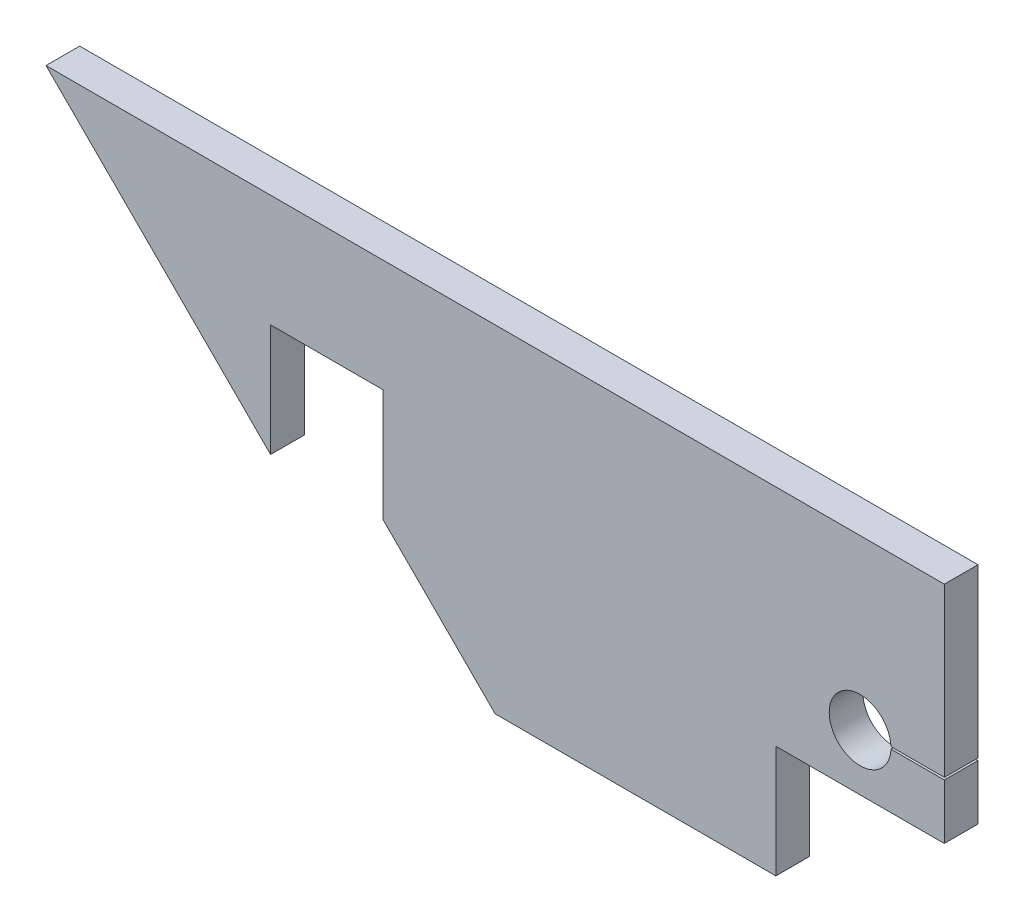
ISO-10303-21;
HEADER;
FILE_DESCRIPTION(('STEP AP214'),'2;1');
FILE_NAME('part.step','',(''),(''),'','','');
FILE_SCHEMA(('AUTOMOTIVE_DESIGN { 1 0 10303 214 1 1 1 1 }'));
ENDSEC;
DATA;
#1=APPLICATION_CONTEXT('core data for automotive mechanical design processes');
#2=APPLICATION_PROTOCOL_DEFINITION('international standard','automotive_design',2000,#1);
#3=PRODUCT_CONTEXT('',#1,'mechanical');
#4=PRODUCT('Part','Part','',(#3));
#5=PRODUCT_RELATED_PRODUCT_CATEGORY('part','',(#4));
#6=PRODUCT_DEFINITION_FORMATION('','',#4);
#7=PRODUCT_DEFINITION_CONTEXT('part definition',#1,'design');
#8=PRODUCT_DEFINITION('design','',#6,#7);
#9=PRODUCT_DEFINITION_SHAPE('','',#8);
#10=(LENGTH_UNIT() NAMED_UNIT(*) SI_UNIT(.MILLI.,.METRE.));
#11=(NAMED_UNIT(*) PLANE_ANGLE_UNIT() SI_UNIT($,.RADIAN.));
#12=(NAMED_UNIT(*) SI_UNIT($,.STERADIAN.) SOLID_ANGLE_UNIT());
#13=UNCERTAINTY_MEASURE_WITH_UNIT(LENGTH_MEASURE(1.E-05),#10,'distance_accuracy_value','');
#14=(GEOMETRIC_REPRESENTATION_CONTEXT(3) GLOBAL_UNCERTAINTY_ASSIGNED_CONTEXT((#13)) GLOBAL_UNIT_ASSIGNED_CONTEXT((#10,
#11,#12)) REPRESENTATION_CONTEXT('',''));
#15=CARTESIAN_POINT('',(0.,0.,0.));
#16=DIRECTION('',(0.,0.,1.));
#17=DIRECTION('',(1.,0.,0.));
#18=AXIS2_PLACEMENT_3D('',#15,#16,#17);
#19=CARTESIAN_POINT('',(40.,-15.,3.));
#20=DIRECTION('',(-1.,0.,0.));
#21=DIRECTION('',(0.,0.,1.));
#22=AXIS2_PLACEMENT_3D('',#19,#20,#21);
#23=PLANE('',#22);
#24=DIRECTION('',(0.,1.,0.));
#25=VECTOR('',#24,1.);
#26=CARTESIAN_POINT('',(40.,-15.,0.));
#27=LINE('',#26,#25);
#28=CARTESIAN_POINT('',(40.,-5.,0.));
#29=VERTEX_POINT('',#28);
#30=CARTESIAN_POINT('',(40.,-0.0999999999999987,0.));
#31=VERTEX_POINT('',#30);
#32=EDGE_CURVE('E173',#29,#31,#27,.T.);
#33=ORIENTED_EDGE('',*,*,#32,.T.);
#34=DIRECTION('',(0.,0.,1.));
#35=VECTOR('',#34,1.);
#36=CARTESIAN_POINT('',(40.,-0.0999999999999987,-7.));
#37=LINE('',#36,#35);
#38=CARTESIAN_POINT('',(40.,-0.0999999999999987,3.));
#39=VERTEX_POINT('',#38);
#40=EDGE_CURVE('E140',#31,#39,#37,.T.);
#41=ORIENTED_EDGE('',*,*,#40,.T.);
#42=DIRECTION('',(0.,1.,0.));
#43=VECTOR('',#42,1.);
#44=CARTESIAN_POINT('',(40.,-15.,3.));
#45=LINE('',#44,#43);
#46=CARTESIAN_POINT('',(40.,-5.,3.));
#47=VERTEX_POINT('',#46);
#48=EDGE_CURVE('E157',#47,#39,#45,.T.);
#49=ORIENTED_EDGE('',*,*,#48,.F.);
#50=DIRECTION('',(0.,0.,1.));
#51=VECTOR('',#50,1.);
#52=CARTESIAN_POINT('',(40.,-5.,0.));
#53=LINE('',#52,#51);
#54=EDGE_CURVE('E210',#29,#47,#53,.T.);
#55=ORIENTED_EDGE('',*,*,#54,.F.);
#56=EDGE_LOOP('',(#33,#41,#49,#55));
#57=FACE_BOUND('',#56,.T.);
#58=ADVANCED_FACE('F35',(#57),#23,.F.);
#59=CARTESIAN_POINT('',(40.,0.0999999999999987,3.));
#60=VERTEX_POINT('',#59);
#61=CARTESIAN_POINT('',(40.,15.,3.));
#62=VERTEX_POINT('',#61);
#63=EDGE_CURVE('E148',#60,#62,#45,.T.);
#64=ORIENTED_EDGE('',*,*,#63,.F.);
#65=DIRECTION('',(0.,0.,1.));
#66=VECTOR('',#65,1.);
#67=CARTESIAN_POINT('',(40.,0.0999999999999987,-7.));
#68=LINE('',#67,#66);
#69=CARTESIAN_POINT('',(40.,0.0999999999999987,0.));
#70=VERTEX_POINT('',#69);
#71=EDGE_CURVE('E133',#70,#60,#68,.T.);
#72=ORIENTED_EDGE('',*,*,#71,.F.);
#73=CARTESIAN_POINT('',(40.,15.,0.));
#74=VERTEX_POINT('',#73);
#75=EDGE_CURVE('E176',#70,#74,#27,.T.);
#76=ORIENTED_EDGE('',*,*,#75,.T.);
#77=DIRECTION('',(0.,0.,-1.));
#78=VECTOR('',#77,1.);
#79=CARTESIAN_POINT('',(40.,15.,3.));
#80=LINE('',#79,#78);
#81=EDGE_CURVE('E156',#62,#74,#80,.T.);
#82=ORIENTED_EDGE('',*,*,#81,.F.);
#83=EDGE_LOOP('',(#64,#72,#76,#82));
#84=FACE_BOUND('',#83,.T.);
#85=ADVANCED_FACE('F37',(#84),#23,.F.);
#86=CARTESIAN_POINT('',(-40.,15.,3.));
#87=DIRECTION('',(0.,-1.,0.));
#88=DIRECTION('',(0.,0.,-1.));
#89=AXIS2_PLACEMENT_3D('',#86,#87,#88);
#90=PLANE('',#89);
#91=DIRECTION('',(-1.,0.,0.));
#92=VECTOR('',#91,1.);
#93=CARTESIAN_POINT('',(-40.,15.,0.));
#94=LINE('',#93,#92);
#95=CARTESIAN_POINT('',(-40.,15.,0.));
#96=VERTEX_POINT('',#95);
#97=EDGE_CURVE('E162',#74,#96,#94,.T.);
#98=ORIENTED_EDGE('',*,*,#97,.T.);
#99=DIRECTION('',(0.,0.,-1.));
#100=VECTOR('',#99,1.);
#101=CARTESIAN_POINT('',(-40.,15.,3.));
#102=LINE('',#101,#100);
#103=CARTESIAN_POINT('',(-40.,15.,3.));
#104=VERTEX_POINT('',#103);
#105=EDGE_CURVE('E172',#104,#96,#102,.T.);
#106=ORIENTED_EDGE('',*,*,#105,.F.);
#107=DIRECTION('',(-1.,0.,0.));
#108=VECTOR('',#107,1.);
#109=CARTESIAN_POINT('',(-40.,15.,3.));
#110=LINE('',#109,#108);
#111=EDGE_CURVE('E160',#62,#104,#110,.T.);
#112=ORIENTED_EDGE('',*,*,#111,.F.);
#113=ORIENTED_EDGE('',*,*,#81,.T.);
#114=EDGE_LOOP('',(#98,#106,#112,#113));
#115=FACE_BOUND('',#114,.T.);
#116=ADVANCED_FACE('F293',(#115),#90,.F.);
#117=CARTESIAN_POINT('',(-40.,-15.,3.));
#118=DIRECTION('',(0.,1.,0.));
#119=DIRECTION('',(0.,0.,1.));
#120=AXIS2_PLACEMENT_3D('',#117,#118,#119);
#121=PLANE('',#120);
#122=DIRECTION('',(1.,0.,0.));
#123=VECTOR('',#122,1.);
#124=CARTESIAN_POINT('',(-40.,-15.,0.));
#125=LINE('',#124,#123);
#126=CARTESIAN_POINT('',(0.,-15.,0.));
#127=VERTEX_POINT('',#126);
#128=CARTESIAN_POINT('',(25.,-15.,0.));
#129=VERTEX_POINT('',#128);
#130=EDGE_CURVE('E158',#127,#129,#125,.T.);
#131=ORIENTED_EDGE('',*,*,#130,.T.);
#132=DIRECTION('',(0.,0.,1.));
#133=VECTOR('',#132,1.);
#134=CARTESIAN_POINT('',(25.,-15.,0.));
#135=LINE('',#134,#133);
#136=CARTESIAN_POINT('',(25.,-15.,3.));
#137=VERTEX_POINT('',#136);
#138=EDGE_CURVE('E203',#129,#137,#135,.T.);
#139=ORIENTED_EDGE('',*,*,#138,.T.);
#140=DIRECTION('',(1.,0.,0.));
#141=VECTOR('',#140,1.);
#142=CARTESIAN_POINT('',(-40.,-15.,3.));
#143=LINE('',#142,#141);
#144=CARTESIAN_POINT('',(0.,-15.,3.));
#145=VERTEX_POINT('',#144);
#146=EDGE_CURVE('E169',#145,#137,#143,.T.);
#147=ORIENTED_EDGE('',*,*,#146,.F.);
#148=DIRECTION('',(0.,0.,1.));
#149=VECTOR('',#148,1.);
#150=CARTESIAN_POINT('',(0.,-15.,0.));
#151=LINE('',#150,#149);
#152=EDGE_CURVE('E242',#127,#145,#151,.T.);
#153=ORIENTED_EDGE('',*,*,#152,.F.);
#154=EDGE_LOOP('',(#131,#139,#147,#153));
#155=FACE_BOUND('',#154,.T.);
#156=ADVANCED_FACE('F269',(#155),#121,.F.);
#157=CARTESIAN_POINT('',(0.,0.,3.));
#158=DIRECTION('',(0.,0.,-1.));
#159=DIRECTION('',(-1.,0.,0.));
#160=AXIS2_PLACEMENT_3D('',#157,#158,#159);
#161=PLANE('',#160);
#162=ORIENTED_EDGE('',*,*,#48,.T.);
#163=DIRECTION('',(1.,0.,0.));
#164=VECTOR('',#163,1.);
#165=CARTESIAN_POINT('',(40.,-0.0999999999999987,3.));
#166=LINE('',#165,#164);
#167=CARTESIAN_POINT('',(35.2481812167323,-0.0999999999999996,3.));
#168=VERTEX_POINT('',#167);
#169=EDGE_CURVE('E141',#168,#39,#166,.T.);
#170=ORIENTED_EDGE('',*,*,#169,.F.);
#171=CARTESIAN_POINT('',(32.5,0.,3.));
#172=DIRECTION('',(0.,0.,1.));
#173=DIRECTION('',(1.,0.,0.));
#174=AXIS2_PLACEMENT_3D('',#171,#172,#173);
#175=CIRCLE('',#174,2.74999999999999);
#176=CARTESIAN_POINT('',(35.2481812167322,0.0999999999999995,3.));
#177=VERTEX_POINT('',#176);
#178=EDGE_CURVE('E152',#177,#168,#175,.T.);
#179=ORIENTED_EDGE('',*,*,#178,.F.);
#180=DIRECTION('',(-1.,0.,0.));
#181=VECTOR('',#180,1.);
#182=CARTESIAN_POINT('',(40.,0.0999999999999987,3.));
#183=LINE('',#182,#181);
#184=EDGE_CURVE('E50',#60,#177,#183,.T.);
#185=ORIENTED_EDGE('',*,*,#184,.F.);
#186=ORIENTED_EDGE('',*,*,#63,.T.);
#187=ORIENTED_EDGE('',*,*,#111,.T.);
#188=DIRECTION('',(-0.707106781186544,0.707106781186551,0.));
#189=VECTOR('',#188,1.);
#190=CARTESIAN_POINT('',(-20.0000000000002,-5.,3.));
#191=LINE('',#190,#189);
#192=CARTESIAN_POINT('',(-20.0000000000002,-5.,3.));
#193=VERTEX_POINT('',#192);
#194=EDGE_CURVE('E218',#193,#104,#191,.T.);
#195=ORIENTED_EDGE('',*,*,#194,.F.);
#196=DIRECTION('',(0.,-1.,0.));
#197=VECTOR('',#196,1.);
#198=CARTESIAN_POINT('',(-20.0000000000002,-5.,3.));
#199=LINE('',#198,#197);
#200=CARTESIAN_POINT('',(-20.0000000000002,5.,3.));
#201=VERTEX_POINT('',#200);
#202=EDGE_CURVE('E238',#201,#193,#199,.T.);
#203=ORIENTED_EDGE('',*,*,#202,.F.);
#204=DIRECTION('',(-1.,0.,0.));
#205=VECTOR('',#204,1.);
#206=CARTESIAN_POINT('',(-20.0000000000002,5.,3.));
#207=LINE('',#206,#205);
#208=CARTESIAN_POINT('',(-10.0000000000002,5.,3.));
#209=VERTEX_POINT('',#208);
#210=EDGE_CURVE('E235',#209,#201,#207,.T.);
#211=ORIENTED_EDGE('',*,*,#210,.F.);
#212=DIRECTION('',(0.,1.,0.));
#213=VECTOR('',#212,1.);
#214=CARTESIAN_POINT('',(-10.0000000000002,-5.,3.));
#215=LINE('',#214,#213);
#216=CARTESIAN_POINT('',(-10.0000000000002,-5.,3.));
#217=VERTEX_POINT('',#216);
#218=EDGE_CURVE('E232',#217,#209,#215,.T.);
#219=ORIENTED_EDGE('',*,*,#218,.F.);
#220=DIRECTION('',(-0.707106781186551,0.707106781186543,0.));
#221=VECTOR('',#220,1.);
#222=CARTESIAN_POINT('',(0.,-15.,3.));
#223=LINE('',#222,#221);
#224=EDGE_CURVE('E209',#145,#217,#223,.T.);
#225=ORIENTED_EDGE('',*,*,#224,.F.);
#226=ORIENTED_EDGE('',*,*,#146,.T.);
#227=DIRECTION('',(0.,-1.,0.));
#228=VECTOR('',#227,1.);
#229=CARTESIAN_POINT('',(25.,-15.,3.));
#230=LINE('',#229,#228);
#231=CARTESIAN_POINT('',(25.,-5.,3.));
#232=VERTEX_POINT('',#231);
#233=EDGE_CURVE('E195',#232,#137,#230,.T.);
#234=ORIENTED_EDGE('',*,*,#233,.F.);
#235=DIRECTION('',(-1.,0.,0.));
#236=VECTOR('',#235,1.);
#237=CARTESIAN_POINT('',(25.,-5.,3.));
#238=LINE('',#237,#236);
#239=EDGE_CURVE('E200',#47,#232,#238,.T.);
#240=ORIENTED_EDGE('',*,*,#239,.F.);
#241=EDGE_LOOP('',(#162,#170,#179,#185,#186,#187,#195,#203,#211,#219,#225,#226,#234,#240));
#242=FACE_BOUND('',#241,.T.);
#243=ADVANCED_FACE('F146',(#242),#161,.F.);
#244=CARTESIAN_POINT('',(0.,0.,0.));
#245=DIRECTION('',(0.,0.,-1.));
#246=DIRECTION('',(-1.,0.,0.));
#247=AXIS2_PLACEMENT_3D('',#244,#245,#246);
#248=PLANE('',#247);
#249=DIRECTION('',(-1.,0.,0.));
#250=VECTOR('',#249,1.);
#251=CARTESIAN_POINT('',(0.,-0.100000000000006,0.));
#252=LINE('',#251,#250);
#253=CARTESIAN_POINT('',(35.2481812167323,-0.0999999999999999,0.));
#254=VERTEX_POINT('',#253);
#255=EDGE_CURVE('E58',#31,#254,#252,.T.);
#256=ORIENTED_EDGE('',*,*,#255,.F.);
#257=ORIENTED_EDGE('',*,*,#32,.F.);
#258=DIRECTION('',(-1.,0.,0.));
#259=VECTOR('',#258,1.);
#260=CARTESIAN_POINT('',(25.,-5.,0.));
#261=LINE('',#260,#259);
#262=CARTESIAN_POINT('',(25.,-5.,0.));
#263=VERTEX_POINT('',#262);
#264=EDGE_CURVE('E199',#29,#263,#261,.T.);
#265=ORIENTED_EDGE('',*,*,#264,.T.);
#266=DIRECTION('',(0.,-1.,0.));
#267=VECTOR('',#266,1.);
#268=CARTESIAN_POINT('',(25.,-15.,0.));
#269=LINE('',#268,#267);
#270=EDGE_CURVE('E196',#263,#129,#269,.T.);
#271=ORIENTED_EDGE('',*,*,#270,.T.);
#272=ORIENTED_EDGE('',*,*,#130,.F.);
#273=DIRECTION('',(-0.707106781186551,0.707106781186543,0.));
#274=VECTOR('',#273,1.);
#275=CARTESIAN_POINT('',(0.,-15.,0.));
#276=LINE('',#275,#274);
#277=CARTESIAN_POINT('',(-10.0000000000002,-5.,0.));
#278=VERTEX_POINT('',#277);
#279=EDGE_CURVE('E214',#127,#278,#276,.T.);
#280=ORIENTED_EDGE('',*,*,#279,.T.);
#281=DIRECTION('',(0.,1.,0.));
#282=VECTOR('',#281,1.);
#283=CARTESIAN_POINT('',(-10.0000000000002,-5.,0.));
#284=LINE('',#283,#282);
#285=CARTESIAN_POINT('',(-10.0000000000002,5.,0.));
#286=VERTEX_POINT('',#285);
#287=EDGE_CURVE('E217',#278,#286,#284,.T.);
#288=ORIENTED_EDGE('',*,*,#287,.T.);
#289=DIRECTION('',(-1.,0.,0.));
#290=VECTOR('',#289,1.);
#291=CARTESIAN_POINT('',(-20.0000000000002,5.,0.));
#292=LINE('',#291,#290);
#293=CARTESIAN_POINT('',(-20.0000000000002,5.,0.));
#294=VERTEX_POINT('',#293);
#295=EDGE_CURVE('E221',#286,#294,#292,.T.);
#296=ORIENTED_EDGE('',*,*,#295,.T.);
#297=DIRECTION('',(0.,-1.,0.));
#298=VECTOR('',#297,1.);
#299=CARTESIAN_POINT('',(-20.0000000000002,-5.,0.));
#300=LINE('',#299,#298);
#301=CARTESIAN_POINT('',(-20.0000000000002,-5.,0.));
#302=VERTEX_POINT('',#301);
#303=EDGE_CURVE('E224',#294,#302,#300,.T.);
#304=ORIENTED_EDGE('',*,*,#303,.T.);
#305=DIRECTION('',(-0.707106781186544,0.707106781186551,0.));
#306=VECTOR('',#305,1.);
#307=CARTESIAN_POINT('',(-20.0000000000002,-5.,0.));
#308=LINE('',#307,#306);
#309=EDGE_CURVE('E227',#302,#96,#308,.T.);
#310=ORIENTED_EDGE('',*,*,#309,.T.);
#311=ORIENTED_EDGE('',*,*,#97,.F.);
#312=ORIENTED_EDGE('',*,*,#75,.F.);
#313=DIRECTION('',(1.,0.,0.));
#314=VECTOR('',#313,1.);
#315=CARTESIAN_POINT('',(0.,0.100000000000006,0.));
#316=LINE('',#315,#314);
#317=CARTESIAN_POINT('',(35.2481812167323,0.0999999999999996,0.));
#318=VERTEX_POINT('',#317);
#319=EDGE_CURVE('E136',#318,#70,#316,.T.);
#320=ORIENTED_EDGE('',*,*,#319,.F.);
#321=CARTESIAN_POINT('',(32.5,0.,0.));
#322=DIRECTION('',(0.,0.,1.));
#323=DIRECTION('',(1.,0.,0.));
#324=AXIS2_PLACEMENT_3D('',#321,#322,#323);
#325=CIRCLE('',#324,2.75);
#326=EDGE_CURVE('E184',#318,#254,#325,.T.);
#327=ORIENTED_EDGE('',*,*,#326,.T.);
#328=EDGE_LOOP('',(#256,#257,#265,#271,#272,#280,#288,#296,#304,#310,#311,#312,#320,#327));
#329=FACE_BOUND('',#328,.T.);
#330=ADVANCED_FACE('F186',(#329),#248,.T.);
#331=CARTESIAN_POINT('',(0.,-15.,0.));
#332=DIRECTION('',(0.707106781186543,0.707106781186552,0.));
#333=DIRECTION('',(-0.707106781186552,0.707106781186543,0.));
#334=AXIS2_PLACEMENT_3D('',#331,#332,#333);
#335=PLANE('',#334);
#336=ORIENTED_EDGE('',*,*,#224,.T.);
#337=DIRECTION('',(0.,0.,1.));
#338=VECTOR('',#337,1.);
#339=CARTESIAN_POINT('',(-10.0000000000002,-5.,0.));
#340=LINE('',#339,#338);
#341=EDGE_CURVE('E166',#278,#217,#340,.T.);
#342=ORIENTED_EDGE('',*,*,#341,.F.);
#343=ORIENTED_EDGE('',*,*,#279,.F.);
#344=ORIENTED_EDGE('',*,*,#152,.T.);
#345=EDGE_LOOP('',(#336,#342,#343,#344));
#346=FACE_BOUND('',#345,.T.);
#347=ADVANCED_FACE('F257',(#346),#335,.F.);
#348=CARTESIAN_POINT('',(-20.0000000000002,-5.,0.));
#349=DIRECTION('',(0.707106781186551,0.707106781186544,0.));
#350=DIRECTION('',(-0.707106781186544,0.707106781186551,0.));
#351=AXIS2_PLACEMENT_3D('',#348,#349,#350);
#352=PLANE('',#351);
#353=ORIENTED_EDGE('',*,*,#194,.T.);
#354=ORIENTED_EDGE('',*,*,#105,.T.);
#355=ORIENTED_EDGE('',*,*,#309,.F.);
#356=DIRECTION('',(0.,0.,1.));
#357=VECTOR('',#356,1.);
#358=CARTESIAN_POINT('',(-20.0000000000002,-5.,0.));
#359=LINE('',#358,#357);
#360=EDGE_CURVE('E244',#302,#193,#359,.T.);
#361=ORIENTED_EDGE('',*,*,#360,.T.);
#362=EDGE_LOOP('',(#353,#354,#355,#361));
#363=FACE_BOUND('',#362,.T.);
#364=ADVANCED_FACE('F309',(#363),#352,.F.);
#365=CARTESIAN_POINT('',(-20.0000000000002,-5.,0.));
#366=DIRECTION('',(-1.,0.,0.));
#367=DIRECTION('',(0.,0.,1.));
#368=AXIS2_PLACEMENT_3D('',#365,#366,#367);
#369=PLANE('',#368);
#370=ORIENTED_EDGE('',*,*,#202,.T.);
#371=ORIENTED_EDGE('',*,*,#360,.F.);
#372=ORIENTED_EDGE('',*,*,#303,.F.);
#373=DIRECTION('',(0.,0.,1.));
#374=VECTOR('',#373,1.);
#375=CARTESIAN_POINT('',(-20.0000000000002,5.,0.));
#376=LINE('',#375,#374);
#377=EDGE_CURVE('E246',#294,#201,#376,.T.);
#378=ORIENTED_EDGE('',*,*,#377,.T.);
#379=EDGE_LOOP('',(#370,#371,#372,#378));
#380=FACE_BOUND('',#379,.T.);
#381=ADVANCED_FACE('F265',(#380),#369,.F.);
#382=CARTESIAN_POINT('',(-20.0000000000002,5.,0.));
#383=DIRECTION('',(0.,1.,0.));
#384=DIRECTION('',(0.,0.,1.));
#385=AXIS2_PLACEMENT_3D('',#382,#383,#384);
#386=PLANE('',#385);
#387=ORIENTED_EDGE('',*,*,#210,.T.);
#388=ORIENTED_EDGE('',*,*,#377,.F.);
#389=ORIENTED_EDGE('',*,*,#295,.F.);
#390=DIRECTION('',(0.,0.,1.));
#391=VECTOR('',#390,1.);
#392=CARTESIAN_POINT('',(-10.0000000000002,5.,0.));
#393=LINE('',#392,#391);
#394=EDGE_CURVE('E247',#286,#209,#393,.T.);
#395=ORIENTED_EDGE('',*,*,#394,.T.);
#396=EDGE_LOOP('',(#387,#388,#389,#395));
#397=FACE_BOUND('',#396,.T.);
#398=ADVANCED_FACE('F262',(#397),#386,.F.);
#399=CARTESIAN_POINT('',(-10.0000000000002,-5.,0.));
#400=DIRECTION('',(1.,0.,0.));
#401=DIRECTION('',(0.,0.,-1.));
#402=AXIS2_PLACEMENT_3D('',#399,#400,#401);
#403=PLANE('',#402);
#404=ORIENTED_EDGE('',*,*,#218,.T.);
#405=ORIENTED_EDGE('',*,*,#394,.F.);
#406=ORIENTED_EDGE('',*,*,#287,.F.);
#407=ORIENTED_EDGE('',*,*,#341,.T.);
#408=EDGE_LOOP('',(#404,#405,#406,#407));
#409=FACE_BOUND('',#408,.T.);
#410=ADVANCED_FACE('F252',(#409),#403,.F.);
#411=CARTESIAN_POINT('',(25.,-15.,0.));
#412=DIRECTION('',(-1.,0.,0.));
#413=DIRECTION('',(0.,0.,1.));
#414=AXIS2_PLACEMENT_3D('',#411,#412,#413);
#415=PLANE('',#414);
#416=ORIENTED_EDGE('',*,*,#233,.T.);
#417=ORIENTED_EDGE('',*,*,#138,.F.);
#418=ORIENTED_EDGE('',*,*,#270,.F.);
#419=DIRECTION('',(0.,0.,1.));
#420=VECTOR('',#419,1.);
#421=CARTESIAN_POINT('',(25.,-5.,0.));
#422=LINE('',#421,#420);
#423=EDGE_CURVE('E207',#263,#232,#422,.T.);
#424=ORIENTED_EDGE('',*,*,#423,.T.);
#425=EDGE_LOOP('',(#416,#417,#418,#424));
#426=FACE_BOUND('',#425,.T.);
#427=ADVANCED_FACE('F274',(#426),#415,.F.);
#428=CARTESIAN_POINT('',(25.,-5.,0.));
#429=DIRECTION('',(0.,1.,0.));
#430=DIRECTION('',(0.,0.,1.));
#431=AXIS2_PLACEMENT_3D('',#428,#429,#430);
#432=PLANE('',#431);
#433=ORIENTED_EDGE('',*,*,#239,.T.);
#434=ORIENTED_EDGE('',*,*,#423,.F.);
#435=ORIENTED_EDGE('',*,*,#264,.F.);
#436=ORIENTED_EDGE('',*,*,#54,.T.);
#437=EDGE_LOOP('',(#433,#434,#435,#436));
#438=FACE_BOUND('',#437,.T.);
#439=ADVANCED_FACE('F277',(#438),#432,.F.);
#440=CARTESIAN_POINT('',(32.5,0.,3.));
#441=DIRECTION('',(0.,0.,1.));
#442=DIRECTION('',(1.,0.,0.));
#443=AXIS2_PLACEMENT_3D('',#440,#441,#442);
#444=CYLINDRICAL_SURFACE('',#443,2.75);
#445=ORIENTED_EDGE('',*,*,#178,.T.);
#446=DIRECTION('',(0.,0.,1.));
#447=VECTOR('',#446,1.);
#448=CARTESIAN_POINT('',(35.2481812167323,-0.0999999999999996,3.));
#449=LINE('',#448,#447);
#450=EDGE_CURVE('E11',#168,#254,#449,.F.);
#451=ORIENTED_EDGE('',*,*,#450,.T.);
#452=ORIENTED_EDGE('',*,*,#326,.F.);
#453=DIRECTION('',(0.,0.,1.));
#454=VECTOR('',#453,1.);
#455=CARTESIAN_POINT('',(35.2481812167323,0.0999999999999996,3.));
#456=LINE('',#455,#454);
#457=EDGE_CURVE('E43',#318,#177,#456,.T.);
#458=ORIENTED_EDGE('',*,*,#457,.T.);
#459=EDGE_LOOP('',(#445,#451,#452,#458));
#460=FACE_BOUND('',#459,.T.);
#461=ADVANCED_FACE('F182',(#460),#444,.F.);
#462=CARTESIAN_POINT('',(40.,0.0999999999999987,-7.));
#463=DIRECTION('',(0.,1.,0.));
#464=DIRECTION('',(-1.,0.,0.));
#465=AXIS2_PLACEMENT_3D('',#462,#463,#464);
#466=PLANE('',#465);
#467=ORIENTED_EDGE('',*,*,#319,.T.);
#468=ORIENTED_EDGE('',*,*,#71,.T.);
#469=ORIENTED_EDGE('',*,*,#184,.T.);
#470=ORIENTED_EDGE('',*,*,#457,.F.);
#471=EDGE_LOOP('',(#467,#468,#469,#470));
#472=FACE_BOUND('',#471,.T.);
#473=ADVANCED_FACE('F134',(#472),#466,.F.);
#474=CARTESIAN_POINT('',(40.,-0.0999999999999987,-7.));
#475=DIRECTION('',(0.,-1.,0.));
#476=DIRECTION('',(1.,0.,0.));
#477=AXIS2_PLACEMENT_3D('',#474,#475,#476);
#478=PLANE('',#477);
#479=ORIENTED_EDGE('',*,*,#255,.T.);
#480=ORIENTED_EDGE('',*,*,#450,.F.);
#481=ORIENTED_EDGE('',*,*,#169,.T.);
#482=ORIENTED_EDGE('',*,*,#40,.F.);
#483=EDGE_LOOP('',(#479,#480,#481,#482));
#484=FACE_BOUND('',#483,.T.);
#485=ADVANCED_FACE('F282',(#484),#478,.F.);
#486=CLOSED_SHELL('',(#58,#85,#116,#156,#243,#330,#347,#364,#381,#398,#410,#427,#439,#461,#473,#485));
#487=MANIFOLD_SOLID_BREP('B2',#486);
#488=ADVANCED_BREP_SHAPE_REPRESENTATION('',(#18,#487),#14);
#489=SHAPE_DEFINITION_REPRESENTATION(#9,#488);
ENDSEC;
END-ISO-10303-21;
